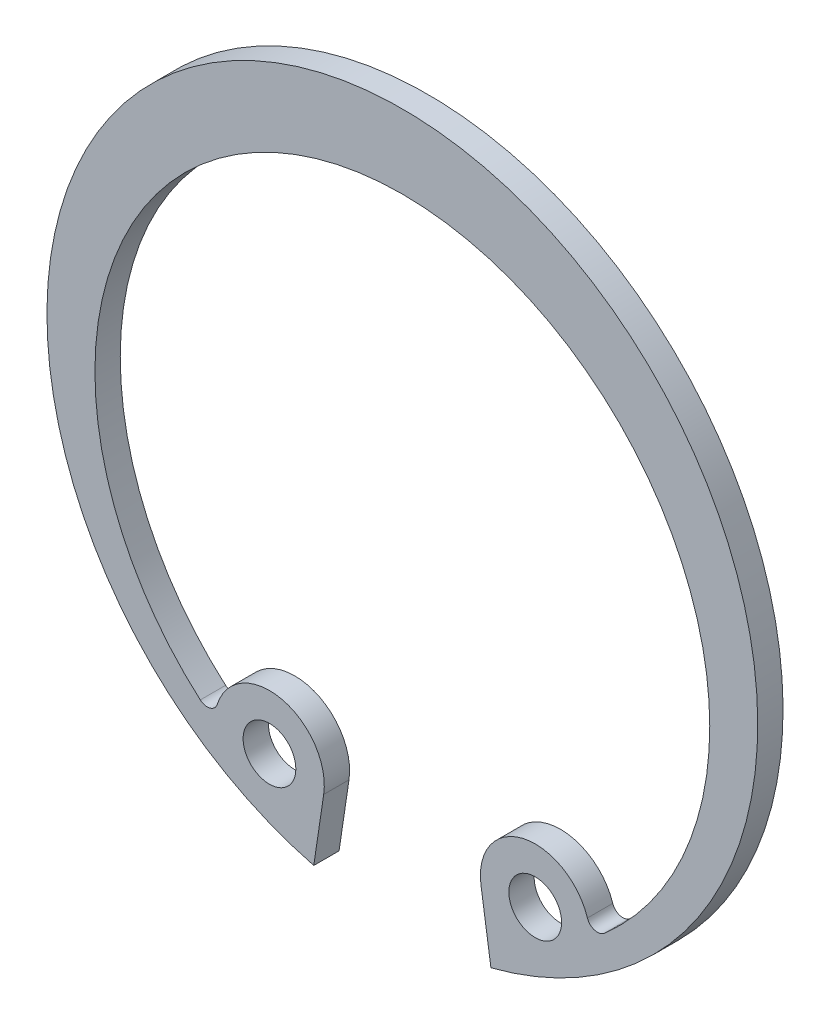
ISO-10303-21;
HEADER;
FILE_DESCRIPTION(('STEP AP214'),'2;1');
FILE_NAME('part.step','',(''),(''),'','','');
FILE_SCHEMA(('AUTOMOTIVE_DESIGN { 1 0 10303 214 1 1 1 1 }'));
ENDSEC;
DATA;
#1=APPLICATION_CONTEXT('core data for automotive mechanical design processes');
#2=APPLICATION_PROTOCOL_DEFINITION('international standard','automotive_design',2000,#1);
#3=PRODUCT_CONTEXT('',#1,'mechanical');
#4=PRODUCT('Part','Part','',(#3));
#5=PRODUCT_RELATED_PRODUCT_CATEGORY('part','',(#4));
#6=PRODUCT_DEFINITION_FORMATION('','',#4);
#7=PRODUCT_DEFINITION_CONTEXT('part definition',#1,'design');
#8=PRODUCT_DEFINITION('design','',#6,#7);
#9=PRODUCT_DEFINITION_SHAPE('','',#8);
#10=(LENGTH_UNIT() NAMED_UNIT(*) SI_UNIT(.MILLI.,.METRE.));
#11=(NAMED_UNIT(*) PLANE_ANGLE_UNIT() SI_UNIT($,.RADIAN.));
#12=(NAMED_UNIT(*) SI_UNIT($,.STERADIAN.) SOLID_ANGLE_UNIT());
#13=UNCERTAINTY_MEASURE_WITH_UNIT(LENGTH_MEASURE(1.E-05),#10,'distance_accuracy_value','');
#14=(GEOMETRIC_REPRESENTATION_CONTEXT(3) GLOBAL_UNCERTAINTY_ASSIGNED_CONTEXT((#13)) GLOBAL_UNIT_ASSIGNED_CONTEXT((#10,
#11,#12)) REPRESENTATION_CONTEXT('',''));
#15=CARTESIAN_POINT('',(0.,0.,0.));
#16=DIRECTION('',(0.,0.,1.));
#17=DIRECTION('',(1.,0.,0.));
#18=AXIS2_PLACEMENT_3D('',#15,#16,#17);
#19=CARTESIAN_POINT('',(-6.3,-12.7813924845418,1.2));
#20=DIRECTION('',(0.,0.,1.));
#21=DIRECTION('',(1.,0.,0.));
#22=AXIS2_PLACEMENT_3D('',#19,#20,#21);
#23=PLANE('',#22);
#24=CARTESIAN_POINT('',(-6.3,-12.7813924845418,1.2));
#25=DIRECTION('',(0.,0.,1.));
#26=DIRECTION('',(1.,0.,0.));
#27=AXIS2_PLACEMENT_3D('',#24,#25,#26);
#28=CIRCLE('',#27,1.25);
#29=CARTESIAN_POINT('',(-5.05,-12.7813924845418,1.2));
#30=VERTEX_POINT('',#29);
#31=EDGE_CURVE('E134',#30,#30,#28,.T.);
#32=ORIENTED_EDGE('',*,*,#31,.F.);
#33=EDGE_LOOP('',(#32));
#34=FACE_BOUND('',#33,.T.);
#35=CARTESIAN_POINT('',(-6.3,-12.7813924845418,1.2));
#36=DIRECTION('',(0.,0.,1.));
#37=DIRECTION('',(1.,0.,0.));
#38=AXIS2_PLACEMENT_3D('',#35,#36,#37);
#39=CIRCLE('',#38,2.59970153525687);
#40=CARTESIAN_POINT('',(-3.72885394162462,-13.1656528375809,1.2));
#41=VERTEX_POINT('',#40);
#42=CARTESIAN_POINT('',(-8.77496974054262,-11.9857965721495,1.2));
#43=VERTEX_POINT('',#42);
#44=EDGE_CURVE('E145',#41,#43,#39,.T.);
#45=ORIENTED_EDGE('',*,*,#44,.T.);
#46=CARTESIAN_POINT('',(-9.25098010307412,-11.8327797927996,1.2));
#47=DIRECTION('',(0.,0.,-1.));
#48=DIRECTION('',(1.,0.,0.));
#49=AXIS2_PLACEMENT_3D('',#46,#47,#48);
#50=CIRCLE('',#49,0.499999999999999);
#51=CARTESIAN_POINT('',(-9.57961172307674,-12.2096103360607,1.2));
#52=VERTEX_POINT('',#51);
#53=EDGE_CURVE('E93',#43,#52,#50,.T.);
#54=ORIENTED_EDGE('',*,*,#53,.T.);
#55=CARTESIAN_POINT('',(0.,-1.225,1.2));
#56=DIRECTION('',(0.,0.,-1.));
#57=DIRECTION('',(1.,0.,0.));
#58=AXIS2_PLACEMENT_3D('',#55,#56,#57);
#59=CIRCLE('',#58,14.575);
#60=CARTESIAN_POINT('',(9.57961172307675,-12.2096103360606,1.2));
#61=VERTEX_POINT('',#60);
#62=EDGE_CURVE('E160',#52,#61,#59,.T.);
#63=ORIENTED_EDGE('',*,*,#62,.T.);
#64=CARTESIAN_POINT('',(9.25098010307412,-11.8327797927996,1.2));
#65=DIRECTION('',(0.,0.,-1.));
#66=DIRECTION('',(-1.,0.,0.));
#67=AXIS2_PLACEMENT_3D('',#64,#65,#66);
#68=CIRCLE('',#67,0.499999999999999);
#69=CARTESIAN_POINT('',(8.77496974054262,-11.9857965721495,1.2));
#70=VERTEX_POINT('',#69);
#71=EDGE_CURVE('E173',#61,#70,#68,.T.);
#72=ORIENTED_EDGE('',*,*,#71,.T.);
#73=CARTESIAN_POINT('',(6.3,-12.7813924845418,1.2));
#74=DIRECTION('',(0.,0.,1.));
#75=DIRECTION('',(1.,0.,0.));
#76=AXIS2_PLACEMENT_3D('',#73,#74,#75);
#77=CIRCLE('',#76,2.59970153525687);
#78=CARTESIAN_POINT('',(3.72885394162462,-13.1656528375809,1.2));
#79=VERTEX_POINT('',#78);
#80=EDGE_CURVE('E112',#70,#79,#77,.T.);
#81=ORIENTED_EDGE('',*,*,#80,.T.);
#82=DIRECTION('',(0.147809411129611,-0.989015863361917,0.));
#83=VECTOR('',#82,1.);
#84=CARTESIAN_POINT('',(3.72885394162462,-13.1656528375809,1.2));
#85=LINE('',#84,#83);
#86=CARTESIAN_POINT('',(4.2,-16.3181647252379,1.2));
#87=VERTEX_POINT('',#86);
#88=EDGE_CURVE('E106',#79,#87,#85,.T.);
#89=ORIENTED_EDGE('',*,*,#88,.T.);
#90=CARTESIAN_POINT('',(0.,0.,1.2));
#91=DIRECTION('',(0.,0.,1.));
#92=DIRECTION('',(1.,0.,0.));
#93=AXIS2_PLACEMENT_3D('',#90,#91,#92);
#94=CIRCLE('',#93,16.85);
#95=CARTESIAN_POINT('',(-4.2,-16.3181647252379,1.2));
#96=VERTEX_POINT('',#95);
#97=EDGE_CURVE('E110',#87,#96,#94,.T.);
#98=ORIENTED_EDGE('',*,*,#97,.T.);
#99=DIRECTION('',(0.147809411129611,0.989015863361917,0.));
#100=VECTOR('',#99,1.);
#101=CARTESIAN_POINT('',(-3.72885394162462,-13.1656528375809,1.2));
#102=LINE('',#101,#100);
#103=EDGE_CURVE('E50',#96,#41,#102,.T.);
#104=ORIENTED_EDGE('',*,*,#103,.T.);
#105=EDGE_LOOP('',(#45,#54,#63,#72,#81,#89,#98,#104));
#106=FACE_BOUND('',#105,.T.);
#107=CARTESIAN_POINT('',(6.3,-12.7813924845418,1.2));
#108=DIRECTION('',(0.,0.,1.));
#109=DIRECTION('',(1.,0.,0.));
#110=AXIS2_PLACEMENT_3D('',#107,#108,#109);
#111=CIRCLE('',#110,1.25);
#112=CARTESIAN_POINT('',(7.55,-12.7813924845418,1.2));
#113=VERTEX_POINT('',#112);
#114=EDGE_CURVE('E182',#113,#113,#111,.T.);
#115=ORIENTED_EDGE('',*,*,#114,.F.);
#116=EDGE_LOOP('',(#115));
#117=FACE_BOUND('',#116,.T.);
#118=ADVANCED_FACE('F33',(#34,#106,#117),#23,.T.);
#119=CARTESIAN_POINT('',(-6.3,-12.7813924845418,0.));
#120=DIRECTION('',(0.,0.,1.));
#121=DIRECTION('',(1.,0.,0.));
#122=AXIS2_PLACEMENT_3D('',#119,#120,#121);
#123=PLANE('',#122);
#124=CARTESIAN_POINT('',(-6.3,-12.7813924845418,0.));
#125=DIRECTION('',(0.,0.,1.));
#126=DIRECTION('',(1.,0.,0.));
#127=AXIS2_PLACEMENT_3D('',#124,#125,#126);
#128=CIRCLE('',#127,2.59970153525687);
#129=CARTESIAN_POINT('',(-3.72885394162462,-13.1656528375809,0.));
#130=VERTEX_POINT('',#129);
#131=CARTESIAN_POINT('',(-8.77496974054262,-11.9857965721495,0.));
#132=VERTEX_POINT('',#131);
#133=EDGE_CURVE('E130',#130,#132,#128,.T.);
#134=ORIENTED_EDGE('',*,*,#133,.F.);
#135=DIRECTION('',(0.147809411129611,0.989015863361917,0.));
#136=VECTOR('',#135,1.);
#137=CARTESIAN_POINT('',(-3.72885394162462,-13.1656528375809,0.));
#138=LINE('',#137,#136);
#139=CARTESIAN_POINT('',(-4.2,-16.3181647252379,0.));
#140=VERTEX_POINT('',#139);
#141=EDGE_CURVE('E85',#140,#130,#138,.T.);
#142=ORIENTED_EDGE('',*,*,#141,.F.);
#143=CARTESIAN_POINT('',(0.,0.,0.));
#144=DIRECTION('',(0.,0.,1.));
#145=DIRECTION('',(1.,0.,0.));
#146=AXIS2_PLACEMENT_3D('',#143,#144,#145);
#147=CIRCLE('',#146,16.85);
#148=CARTESIAN_POINT('',(4.2,-16.3181647252379,0.));
#149=VERTEX_POINT('',#148);
#150=EDGE_CURVE('E79',#149,#140,#147,.T.);
#151=ORIENTED_EDGE('',*,*,#150,.F.);
#152=DIRECTION('',(0.147809411129611,-0.989015863361917,0.));
#153=VECTOR('',#152,1.);
#154=CARTESIAN_POINT('',(3.72885394162462,-13.1656528375809,0.));
#155=LINE('',#154,#153);
#156=CARTESIAN_POINT('',(3.72885394162462,-13.1656528375809,0.));
#157=VERTEX_POINT('',#156);
#158=EDGE_CURVE('E120',#157,#149,#155,.T.);
#159=ORIENTED_EDGE('',*,*,#158,.F.);
#160=CARTESIAN_POINT('',(6.3,-12.7813924845418,0.));
#161=DIRECTION('',(0.,0.,1.));
#162=DIRECTION('',(1.,0.,0.));
#163=AXIS2_PLACEMENT_3D('',#160,#161,#162);
#164=CIRCLE('',#163,2.59970153525687);
#165=CARTESIAN_POINT('',(8.77496974054262,-11.9857965721495,0.));
#166=VERTEX_POINT('',#165);
#167=EDGE_CURVE('E140',#166,#157,#164,.T.);
#168=ORIENTED_EDGE('',*,*,#167,.F.);
#169=CARTESIAN_POINT('',(9.25098010307412,-11.8327797927996,0.));
#170=DIRECTION('',(0.,0.,-1.));
#171=DIRECTION('',(-1.,0.,0.));
#172=AXIS2_PLACEMENT_3D('',#169,#170,#171);
#173=CIRCLE('',#172,0.499999999999999);
#174=CARTESIAN_POINT('',(9.57961172307675,-12.2096103360606,0.));
#175=VERTEX_POINT('',#174);
#176=EDGE_CURVE('E138',#175,#166,#173,.T.);
#177=ORIENTED_EDGE('',*,*,#176,.F.);
#178=CARTESIAN_POINT('',(0.,-1.225,0.));
#179=DIRECTION('',(0.,0.,-1.));
#180=DIRECTION('',(1.,0.,0.));
#181=AXIS2_PLACEMENT_3D('',#178,#179,#180);
#182=CIRCLE('',#181,14.575);
#183=CARTESIAN_POINT('',(-9.57961172307674,-12.2096103360607,0.));
#184=VERTEX_POINT('',#183);
#185=EDGE_CURVE('E136',#184,#175,#182,.T.);
#186=ORIENTED_EDGE('',*,*,#185,.F.);
#187=CARTESIAN_POINT('',(-9.25098010307412,-11.8327797927996,0.));
#188=DIRECTION('',(0.,0.,-1.));
#189=DIRECTION('',(1.,0.,0.));
#190=AXIS2_PLACEMENT_3D('',#187,#188,#189);
#191=CIRCLE('',#190,0.499999999999999);
#192=EDGE_CURVE('E133',#132,#184,#191,.T.);
#193=ORIENTED_EDGE('',*,*,#192,.F.);
#194=EDGE_LOOP('',(#134,#142,#151,#159,#168,#177,#186,#193));
#195=FACE_BOUND('',#194,.T.);
#196=CARTESIAN_POINT('',(-6.3,-12.7813924845418,0.));
#197=DIRECTION('',(0.,0.,1.));
#198=DIRECTION('',(1.,0.,0.));
#199=AXIS2_PLACEMENT_3D('',#196,#197,#198);
#200=CIRCLE('',#199,1.25);
#201=CARTESIAN_POINT('',(-5.05,-12.7813924845418,0.));
#202=VERTEX_POINT('',#201);
#203=EDGE_CURVE('E179',#202,#202,#200,.T.);
#204=ORIENTED_EDGE('',*,*,#203,.T.);
#205=EDGE_LOOP('',(#204));
#206=FACE_BOUND('',#205,.T.);
#207=CARTESIAN_POINT('',(6.3,-12.7813924845418,0.));
#208=DIRECTION('',(0.,0.,1.));
#209=DIRECTION('',(1.,0.,0.));
#210=AXIS2_PLACEMENT_3D('',#207,#208,#209);
#211=CIRCLE('',#210,1.25);
#212=CARTESIAN_POINT('',(7.55,-12.7813924845418,0.));
#213=VERTEX_POINT('',#212);
#214=EDGE_CURVE('E185',#213,#213,#211,.T.);
#215=ORIENTED_EDGE('',*,*,#214,.T.);
#216=EDGE_LOOP('',(#215));
#217=FACE_BOUND('',#216,.T.);
#218=ADVANCED_FACE('F164',(#195,#206,#217),#123,.F.);
#219=CARTESIAN_POINT('',(-6.3,-12.7813924845418,1.2));
#220=DIRECTION('',(0.,0.,-1.));
#221=DIRECTION('',(-1.,0.,0.));
#222=AXIS2_PLACEMENT_3D('',#219,#220,#221);
#223=CYLINDRICAL_SURFACE('',#222,2.59970153525687);
#224=ORIENTED_EDGE('',*,*,#133,.T.);
#225=DIRECTION('',(0.,0.,-1.));
#226=VECTOR('',#225,1.);
#227=CARTESIAN_POINT('',(-8.77496974054262,-11.9857965721495,1.2));
#228=LINE('',#227,#226);
#229=EDGE_CURVE('E11',#43,#132,#228,.T.);
#230=ORIENTED_EDGE('',*,*,#229,.F.);
#231=ORIENTED_EDGE('',*,*,#44,.F.);
#232=DIRECTION('',(0.,0.,-1.));
#233=VECTOR('',#232,1.);
#234=CARTESIAN_POINT('',(-3.72885394162462,-13.1656528375809,1.2));
#235=LINE('',#234,#233);
#236=EDGE_CURVE('E126',#41,#130,#235,.T.);
#237=ORIENTED_EDGE('',*,*,#236,.T.);
#238=EDGE_LOOP('',(#224,#230,#231,#237));
#239=FACE_BOUND('',#238,.T.);
#240=ADVANCED_FACE('F35',(#239),#223,.T.);
#241=CARTESIAN_POINT('',(-9.25098010307412,-11.8327797927996,1.2));
#242=DIRECTION('',(0.,0.,-1.));
#243=DIRECTION('',(-1.,0.,0.));
#244=AXIS2_PLACEMENT_3D('',#241,#242,#243);
#245=CYLINDRICAL_SURFACE('',#244,0.499999999999999);
#246=ORIENTED_EDGE('',*,*,#192,.T.);
#247=DIRECTION('',(0.,0.,-1.));
#248=VECTOR('',#247,1.);
#249=CARTESIAN_POINT('',(-9.57961172307674,-12.2096103360607,1.2));
#250=LINE('',#249,#248);
#251=EDGE_CURVE('E42',#52,#184,#250,.T.);
#252=ORIENTED_EDGE('',*,*,#251,.F.);
#253=ORIENTED_EDGE('',*,*,#53,.F.);
#254=ORIENTED_EDGE('',*,*,#229,.T.);
#255=EDGE_LOOP('',(#246,#252,#253,#254));
#256=FACE_BOUND('',#255,.T.);
#257=ADVANCED_FACE('F217',(#256),#245,.F.);
#258=CARTESIAN_POINT('',(0.,-1.225,1.2));
#259=DIRECTION('',(0.,0.,-1.));
#260=DIRECTION('',(-1.,0.,0.));
#261=AXIS2_PLACEMENT_3D('',#258,#259,#260);
#262=CYLINDRICAL_SURFACE('',#261,14.575);
#263=ORIENTED_EDGE('',*,*,#185,.T.);
#264=DIRECTION('',(0.,0.,-1.));
#265=VECTOR('',#264,1.);
#266=CARTESIAN_POINT('',(9.57961172307675,-12.2096103360606,1.2));
#267=LINE('',#266,#265);
#268=EDGE_CURVE('E152',#61,#175,#267,.T.);
#269=ORIENTED_EDGE('',*,*,#268,.F.);
#270=ORIENTED_EDGE('',*,*,#62,.F.);
#271=ORIENTED_EDGE('',*,*,#251,.T.);
#272=EDGE_LOOP('',(#263,#269,#270,#271));
#273=FACE_BOUND('',#272,.T.);
#274=ADVANCED_FACE('F158',(#273),#262,.F.);
#275=CARTESIAN_POINT('',(9.25098010307412,-11.8327797927996,1.2));
#276=DIRECTION('',(0.,0.,-1.));
#277=DIRECTION('',(-1.,0.,0.));
#278=AXIS2_PLACEMENT_3D('',#275,#276,#277);
#279=CYLINDRICAL_SURFACE('',#278,0.499999999999999);
#280=ORIENTED_EDGE('',*,*,#176,.T.);
#281=DIRECTION('',(0.,0.,-1.));
#282=VECTOR('',#281,1.);
#283=CARTESIAN_POINT('',(8.77496974054262,-11.9857965721495,1.2));
#284=LINE('',#283,#282);
#285=EDGE_CURVE('E149',#70,#166,#284,.T.);
#286=ORIENTED_EDGE('',*,*,#285,.F.);
#287=ORIENTED_EDGE('',*,*,#71,.F.);
#288=ORIENTED_EDGE('',*,*,#268,.T.);
#289=EDGE_LOOP('',(#280,#286,#287,#288));
#290=FACE_BOUND('',#289,.T.);
#291=ADVANCED_FACE('F169',(#290),#279,.F.);
#292=CARTESIAN_POINT('',(6.3,-12.7813924845418,1.2));
#293=DIRECTION('',(0.,0.,-1.));
#294=DIRECTION('',(-1.,0.,0.));
#295=AXIS2_PLACEMENT_3D('',#292,#293,#294);
#296=CYLINDRICAL_SURFACE('',#295,2.59970153525687);
#297=ORIENTED_EDGE('',*,*,#167,.T.);
#298=DIRECTION('',(0.,0.,-1.));
#299=VECTOR('',#298,1.);
#300=CARTESIAN_POINT('',(3.72885394162462,-13.1656528375809,1.2));
#301=LINE('',#300,#299);
#302=EDGE_CURVE('E121',#79,#157,#301,.T.);
#303=ORIENTED_EDGE('',*,*,#302,.F.);
#304=ORIENTED_EDGE('',*,*,#80,.F.);
#305=ORIENTED_EDGE('',*,*,#285,.T.);
#306=EDGE_LOOP('',(#297,#303,#304,#305));
#307=FACE_BOUND('',#306,.T.);
#308=ADVANCED_FACE('F172',(#307),#296,.T.);
#309=CARTESIAN_POINT('',(3.72885394162462,-13.1656528375809,1.2));
#310=DIRECTION('',(0.989015863361917,0.147809411129611,0.));
#311=DIRECTION('',(-0.147809411129611,0.989015863361917,0.));
#312=AXIS2_PLACEMENT_3D('',#309,#310,#311);
#313=PLANE('',#312);
#314=ORIENTED_EDGE('',*,*,#158,.T.);
#315=DIRECTION('',(0.,0.,-1.));
#316=VECTOR('',#315,1.);
#317=CARTESIAN_POINT('',(4.2,-16.3181647252379,1.2));
#318=LINE('',#317,#316);
#319=EDGE_CURVE('E117',#87,#149,#318,.T.);
#320=ORIENTED_EDGE('',*,*,#319,.F.);
#321=ORIENTED_EDGE('',*,*,#88,.F.);
#322=ORIENTED_EDGE('',*,*,#302,.T.);
#323=EDGE_LOOP('',(#314,#320,#321,#322));
#324=FACE_BOUND('',#323,.T.);
#325=ADVANCED_FACE('F118',(#324),#313,.F.);
#326=CARTESIAN_POINT('',(0.,0.,1.2));
#327=DIRECTION('',(0.,0.,-1.));
#328=DIRECTION('',(-1.,0.,0.));
#329=AXIS2_PLACEMENT_3D('',#326,#327,#328);
#330=CYLINDRICAL_SURFACE('',#329,16.85);
#331=ORIENTED_EDGE('',*,*,#150,.T.);
#332=DIRECTION('',(0.,0.,-1.));
#333=VECTOR('',#332,1.);
#334=CARTESIAN_POINT('',(-4.2,-16.3181647252379,1.2));
#335=LINE('',#334,#333);
#336=EDGE_CURVE('E122',#96,#140,#335,.T.);
#337=ORIENTED_EDGE('',*,*,#336,.F.);
#338=ORIENTED_EDGE('',*,*,#97,.F.);
#339=ORIENTED_EDGE('',*,*,#319,.T.);
#340=EDGE_LOOP('',(#331,#337,#338,#339));
#341=FACE_BOUND('',#340,.T.);
#342=ADVANCED_FACE('F124',(#341),#330,.T.);
#343=CARTESIAN_POINT('',(-3.72885394162462,-13.1656528375809,1.2));
#344=DIRECTION('',(-0.989015863361917,0.147809411129611,0.));
#345=DIRECTION('',(-0.147809411129611,-0.989015863361917,0.));
#346=AXIS2_PLACEMENT_3D('',#343,#344,#345);
#347=PLANE('',#346);
#348=ORIENTED_EDGE('',*,*,#141,.T.);
#349=ORIENTED_EDGE('',*,*,#236,.F.);
#350=ORIENTED_EDGE('',*,*,#103,.F.);
#351=ORIENTED_EDGE('',*,*,#336,.T.);
#352=EDGE_LOOP('',(#348,#349,#350,#351));
#353=FACE_BOUND('',#352,.T.);
#354=ADVANCED_FACE('F205',(#353),#347,.F.);
#355=CARTESIAN_POINT('',(-6.3,-12.7813924845418,1.2));
#356=DIRECTION('',(0.,0.,-1.));
#357=DIRECTION('',(-1.,0.,0.));
#358=AXIS2_PLACEMENT_3D('',#355,#356,#357);
#359=CYLINDRICAL_SURFACE('',#358,1.25);
#360=ORIENTED_EDGE('',*,*,#31,.T.);
#361=EDGE_LOOP('',(#360));
#362=FACE_BOUND('',#361,.T.);
#363=ORIENTED_EDGE('',*,*,#203,.F.);
#364=EDGE_LOOP('',(#363));
#365=FACE_BOUND('',#364,.T.);
#366=ADVANCED_FACE('F202',(#362,#365),#359,.F.);
#367=CARTESIAN_POINT('',(6.3,-12.7813924845418,1.2));
#368=DIRECTION('',(0.,0.,-1.));
#369=DIRECTION('',(-1.,0.,0.));
#370=AXIS2_PLACEMENT_3D('',#367,#368,#369);
#371=CYLINDRICAL_SURFACE('',#370,1.25);
#372=ORIENTED_EDGE('',*,*,#114,.T.);
#373=EDGE_LOOP('',(#372));
#374=FACE_BOUND('',#373,.T.);
#375=ORIENTED_EDGE('',*,*,#214,.F.);
#376=EDGE_LOOP('',(#375));
#377=FACE_BOUND('',#376,.T.);
#378=ADVANCED_FACE('F191',(#374,#377),#371,.F.);
#379=CLOSED_SHELL('',(#118,#218,#240,#257,#274,#291,#308,#325,#342,#354,#366,#378));
#380=MANIFOLD_SOLID_BREP('B2',#379);
#381=ADVANCED_BREP_SHAPE_REPRESENTATION('',(#18,#380),#14);
#382=SHAPE_DEFINITION_REPRESENTATION(#9,#381);
ENDSEC;
END-ISO-10303-21;
